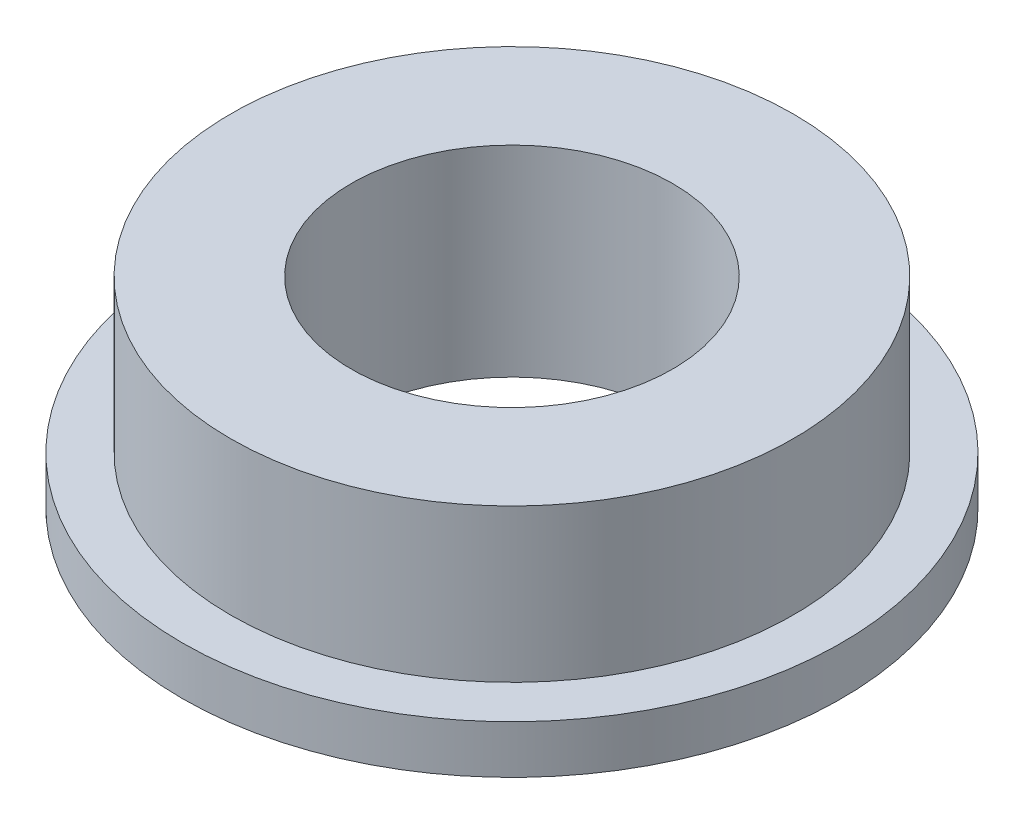
ISO-10303-21;
HEADER;
FILE_DESCRIPTION(('STEP AP214'),'2;1');
FILE_NAME('part.step','',(''),(''),'','','');
FILE_SCHEMA(('AUTOMOTIVE_DESIGN { 1 0 10303 214 1 1 1 1 }'));
ENDSEC;
DATA;
#1=APPLICATION_CONTEXT('core data for automotive mechanical design processes');
#2=APPLICATION_PROTOCOL_DEFINITION('international standard','automotive_design',2000,#1);
#3=PRODUCT_CONTEXT('',#1,'mechanical');
#4=PRODUCT('Part','Part','',(#3));
#5=PRODUCT_RELATED_PRODUCT_CATEGORY('part','',(#4));
#6=PRODUCT_DEFINITION_FORMATION('','',#4);
#7=PRODUCT_DEFINITION_CONTEXT('part definition',#1,'design');
#8=PRODUCT_DEFINITION('design','',#6,#7);
#9=PRODUCT_DEFINITION_SHAPE('','',#8);
#10=(LENGTH_UNIT() NAMED_UNIT(*) SI_UNIT(.MILLI.,.METRE.));
#11=(NAMED_UNIT(*) PLANE_ANGLE_UNIT() SI_UNIT($,.RADIAN.));
#12=(NAMED_UNIT(*) SI_UNIT($,.STERADIAN.) SOLID_ANGLE_UNIT());
#13=UNCERTAINTY_MEASURE_WITH_UNIT(LENGTH_MEASURE(1.E-05),#10,'distance_accuracy_value','');
#14=(GEOMETRIC_REPRESENTATION_CONTEXT(3) GLOBAL_UNCERTAINTY_ASSIGNED_CONTEXT((#13)) GLOBAL_UNIT_ASSIGNED_CONTEXT((#10,
#11,#12)) REPRESENTATION_CONTEXT('',''));
#15=CARTESIAN_POINT('',(0.,0.,0.));
#16=DIRECTION('',(0.,0.,1.));
#17=DIRECTION('',(1.,0.,0.));
#18=AXIS2_PLACEMENT_3D('',#15,#16,#17);
#19=CARTESIAN_POINT('',(0.,0.6,0.));
#20=DIRECTION('',(0.,-1.,0.));
#21=DIRECTION('',(0.,0.,-1.));
#22=AXIS2_PLACEMENT_3D('',#19,#20,#21);
#23=CYLINDRICAL_SURFACE('',#22,4.1);
#24=CARTESIAN_POINT('',(0.,0.6,0.));
#25=DIRECTION('',(0.,1.,0.));
#26=DIRECTION('',(0.,0.,1.));
#27=AXIS2_PLACEMENT_3D('',#24,#25,#26);
#28=CIRCLE('',#27,4.1);
#29=CARTESIAN_POINT('',(0.,0.6,4.1));
#30=VERTEX_POINT('',#29);
#31=EDGE_CURVE('E44',#30,#30,#28,.T.);
#32=ORIENTED_EDGE('',*,*,#31,.F.);
#33=EDGE_LOOP('',(#32));
#34=FACE_BOUND('',#33,.T.);
#35=CARTESIAN_POINT('',(0.,0.,0.));
#36=DIRECTION('',(0.,1.,0.));
#37=DIRECTION('',(0.,0.,1.));
#38=AXIS2_PLACEMENT_3D('',#35,#36,#37);
#39=CIRCLE('',#38,4.1);
#40=CARTESIAN_POINT('',(0.,0.,4.1));
#41=VERTEX_POINT('',#40);
#42=EDGE_CURVE('E40',#41,#41,#39,.T.);
#43=ORIENTED_EDGE('',*,*,#42,.T.);
#44=EDGE_LOOP('',(#43));
#45=FACE_BOUND('',#44,.T.);
#46=ADVANCED_FACE('F37',(#34,#45),#23,.T.);
#47=CARTESIAN_POINT('',(0.,0.6,0.));
#48=DIRECTION('',(0.,1.,0.));
#49=DIRECTION('',(0.,0.,1.));
#50=AXIS2_PLACEMENT_3D('',#47,#48,#49);
#51=PLANE('',#50);
#52=CARTESIAN_POINT('',(0.,0.6,0.));
#53=DIRECTION('',(0.,1.,0.));
#54=DIRECTION('',(0.,0.,1.));
#55=AXIS2_PLACEMENT_3D('',#52,#53,#54);
#56=CIRCLE('',#55,3.5);
#57=CARTESIAN_POINT('',(0.,0.6,-3.5));
#58=VERTEX_POINT('',#57);
#59=EDGE_CURVE('E10',#58,#58,#56,.T.);
#60=ORIENTED_EDGE('',*,*,#59,.F.);
#61=EDGE_LOOP('',(#60));
#62=FACE_BOUND('',#61,.T.);
#63=ORIENTED_EDGE('',*,*,#31,.T.);
#64=EDGE_LOOP('',(#63));
#65=FACE_BOUND('',#64,.T.);
#66=ADVANCED_FACE('F66',(#62,#65),#51,.T.);
#67=CARTESIAN_POINT('',(0.,0.,0.));
#68=DIRECTION('',(0.,1.,0.));
#69=DIRECTION('',(0.,0.,1.));
#70=AXIS2_PLACEMENT_3D('',#67,#68,#69);
#71=PLANE('',#70);
#72=CARTESIAN_POINT('',(0.,0.,0.));
#73=DIRECTION('',(0.,-1.,0.));
#74=DIRECTION('',(0.,0.,-1.));
#75=AXIS2_PLACEMENT_3D('',#72,#73,#74);
#76=CIRCLE('',#75,2.00000000000001);
#77=CARTESIAN_POINT('',(0.,0.,-2.00000000000001));
#78=VERTEX_POINT('',#77);
#79=EDGE_CURVE('E56',#78,#78,#76,.T.);
#80=ORIENTED_EDGE('',*,*,#79,.F.);
#81=EDGE_LOOP('',(#80));
#82=FACE_BOUND('',#81,.T.);
#83=ORIENTED_EDGE('',*,*,#42,.F.);
#84=EDGE_LOOP('',(#83));
#85=FACE_BOUND('',#84,.T.);
#86=ADVANCED_FACE('F62',(#82,#85),#71,.F.);
#87=CARTESIAN_POINT('',(0.,2.5,0.));
#88=DIRECTION('',(0.,-1.,0.));
#89=DIRECTION('',(0.,0.,-1.));
#90=AXIS2_PLACEMENT_3D('',#87,#88,#89);
#91=CYLINDRICAL_SURFACE('',#90,3.5);
#92=CARTESIAN_POINT('',(0.,2.5,0.));
#93=DIRECTION('',(0.,1.,0.));
#94=DIRECTION('',(0.,0.,1.));
#95=AXIS2_PLACEMENT_3D('',#92,#93,#94);
#96=CIRCLE('',#95,3.5);
#97=CARTESIAN_POINT('',(0.,2.5,-3.5));
#98=VERTEX_POINT('',#97);
#99=EDGE_CURVE('E50',#98,#98,#96,.T.);
#100=CARTESIAN_POINT('',(0.,2.5,-3.5));
#101=CARTESIAN_POINT('',(0.,2.48020833333333,-3.5));
#102=CARTESIAN_POINT('',(0.,2.46041666666667,-3.5));
#103=CARTESIAN_POINT('',(0.,2.42083333333333,-3.5));
#104=CARTESIAN_POINT('',(0.,2.40104166666667,-3.5));
#105=CARTESIAN_POINT('',(0.,2.36145833333333,-3.5));
#106=CARTESIAN_POINT('',(0.,2.34166666666667,-3.5));
#107=CARTESIAN_POINT('',(0.,2.30208333333333,-3.5));
#108=CARTESIAN_POINT('',(0.,2.28229166666667,-3.5));
#109=CARTESIAN_POINT('',(0.,2.24270833333333,-3.5));
#110=CARTESIAN_POINT('',(0.,2.22291666666667,-3.5));
#111=CARTESIAN_POINT('',(0.,2.18333333333333,-3.5));
#112=CARTESIAN_POINT('',(0.,2.16354166666667,-3.5));
#113=CARTESIAN_POINT('',(0.,2.12395833333333,-3.5));
#114=CARTESIAN_POINT('',(0.,2.10416666666667,-3.5));
#115=CARTESIAN_POINT('',(0.,2.06458333333333,-3.5));
#116=CARTESIAN_POINT('',(0.,2.04479166666667,-3.5));
#117=CARTESIAN_POINT('',(0.,2.00520833333333,-3.5));
#118=CARTESIAN_POINT('',(0.,1.98541666666667,-3.5));
#119=CARTESIAN_POINT('',(0.,1.94583333333333,-3.5));
#120=CARTESIAN_POINT('',(0.,1.92604166666667,-3.5));
#121=CARTESIAN_POINT('',(0.,1.88645833333333,-3.5));
#122=CARTESIAN_POINT('',(0.,1.86666666666667,-3.5));
#123=CARTESIAN_POINT('',(0.,1.82708333333333,-3.5));
#124=CARTESIAN_POINT('',(0.,1.80729166666667,-3.5));
#125=CARTESIAN_POINT('',(0.,1.76770833333333,-3.5));
#126=CARTESIAN_POINT('',(0.,1.74791666666667,-3.5));
#127=CARTESIAN_POINT('',(0.,1.70833333333333,-3.5));
#128=CARTESIAN_POINT('',(0.,1.68854166666667,-3.5));
#129=CARTESIAN_POINT('',(0.,1.64895833333333,-3.5));
#130=CARTESIAN_POINT('',(0.,1.62916666666667,-3.5));
#131=CARTESIAN_POINT('',(0.,1.58958333333333,-3.5));
#132=CARTESIAN_POINT('',(0.,1.56979166666667,-3.5));
#133=CARTESIAN_POINT('',(0.,1.53020833333333,-3.5));
#134=CARTESIAN_POINT('',(0.,1.51041666666667,-3.5));
#135=CARTESIAN_POINT('',(0.,1.47083333333333,-3.5));
#136=CARTESIAN_POINT('',(0.,1.45104166666667,-3.5));
#137=CARTESIAN_POINT('',(0.,1.41145833333333,-3.5));
#138=CARTESIAN_POINT('',(0.,1.39166666666667,-3.5));
#139=CARTESIAN_POINT('',(0.,1.35208333333333,-3.5));
#140=CARTESIAN_POINT('',(0.,1.33229166666667,-3.5));
#141=CARTESIAN_POINT('',(0.,1.29270833333333,-3.5));
#142=CARTESIAN_POINT('',(0.,1.27291666666667,-3.5));
#143=CARTESIAN_POINT('',(0.,1.23333333333333,-3.5));
#144=CARTESIAN_POINT('',(0.,1.21354166666667,-3.5));
#145=CARTESIAN_POINT('',(0.,1.17395833333333,-3.5));
#146=CARTESIAN_POINT('',(0.,1.15416666666667,-3.5));
#147=CARTESIAN_POINT('',(0.,1.11458333333333,-3.5));
#148=CARTESIAN_POINT('',(0.,1.09479166666667,-3.5));
#149=CARTESIAN_POINT('',(0.,1.05520833333333,-3.5));
#150=CARTESIAN_POINT('',(0.,1.03541666666667,-3.5));
#151=CARTESIAN_POINT('',(0.,0.995833333333333,-3.5));
#152=CARTESIAN_POINT('',(0.,0.976041666666667,-3.5));
#153=CARTESIAN_POINT('',(0.,0.936458333333333,-3.5));
#154=CARTESIAN_POINT('',(0.,0.916666666666667,-3.5));
#155=CARTESIAN_POINT('',(0.,0.877083333333333,-3.5));
#156=CARTESIAN_POINT('',(0.,0.857291666666667,-3.5));
#157=CARTESIAN_POINT('',(0.,0.817708333333333,-3.5));
#158=CARTESIAN_POINT('',(0.,0.797916666666667,-3.5));
#159=CARTESIAN_POINT('',(0.,0.758333333333333,-3.5));
#160=CARTESIAN_POINT('',(0.,0.738541666666667,-3.5));
#161=CARTESIAN_POINT('',(0.,0.698958333333333,-3.5));
#162=CARTESIAN_POINT('',(0.,0.679166666666667,-3.5));
#163=CARTESIAN_POINT('',(0.,0.639583333333333,-3.5));
#164=CARTESIAN_POINT('',(0.,0.619791666666667,-3.5));
#165=CARTESIAN_POINT('',(0.,0.6,-3.5));
#166=B_SPLINE_CURVE_WITH_KNOTS('',3,(#100,#101,#102,#103,#104,#105,#106,#107,#108,#109,#110,
#111,#112,#113,#114,#115,#116,#117,#118,#119,#120,#121,#122,#123,#124,#125,#126,#127,#128,#129,
#130,#131,#132,#133,#134,#135,#136,#137,#138,#139,#140,#141,#142,#143,#144,#145,#146,#147,#148,
#149,#150,#151,#152,#153,#154,#155,#156,#157,#158,#159,#160,#161,#162,#163,#164,#165),
.UNSPECIFIED.,.F.,.F.,(4,2,2,2,2,2,2,2,2,2,2,2,2,2,2,2,2,2,2,2,2,2,2,2,2,2,2,2,2,2,2,2,4),(0.,
0.059375,0.11875,0.178125,0.2375,0.296875,0.35625,0.415625,0.475,0.534375,0.59375,0.653125,
0.7125,0.771875,0.831249999999999,0.890625,0.95,1.009375,1.06875,1.128125,1.1875,1.246875,
1.30625,1.365625,1.425,1.484375,1.54375,1.603125,1.6625,1.721875,1.78125,1.840625,1.9),.UNSPECIFIED.);
#167=EDGE_CURVE('BSEAM65',#98,#58,#166,.T.);
#168=ORIENTED_EDGE('',*,*,#99,.F.);
#169=ORIENTED_EDGE('',*,*,#59,.T.);
#170=ORIENTED_EDGE('',*,*,#167,.T.);
#171=ORIENTED_EDGE('',*,*,#167,.F.);
#172=EDGE_LOOP('',(#168,#170,#169,#171));
#173=FACE_BOUND('',#172,.T.);
#174=ADVANCED_FACE('F65',(#173),#91,.T.);
#175=CARTESIAN_POINT('',(0.,2.5,0.));
#176=DIRECTION('',(0.,1.,0.));
#177=DIRECTION('',(0.,0.,1.));
#178=AXIS2_PLACEMENT_3D('',#175,#176,#177);
#179=PLANE('',#178);
#180=CARTESIAN_POINT('',(0.,2.5,0.));
#181=DIRECTION('',(0.,-1.,0.));
#182=DIRECTION('',(0.,0.,-1.));
#183=AXIS2_PLACEMENT_3D('',#180,#181,#182);
#184=CIRCLE('',#183,2.00000000000001);
#185=CARTESIAN_POINT('',(0.,2.5,-2.00000000000001));
#186=VERTEX_POINT('',#185);
#187=EDGE_CURVE('E53',#186,#186,#184,.T.);
#188=ORIENTED_EDGE('',*,*,#187,.T.);
#189=EDGE_LOOP('',(#188));
#190=FACE_BOUND('',#189,.T.);
#191=ORIENTED_EDGE('',*,*,#99,.T.);
#192=EDGE_LOOP('',(#191));
#193=FACE_BOUND('',#192,.T.);
#194=ADVANCED_FACE('F84',(#190,#193),#179,.T.);
#195=CARTESIAN_POINT('',(0.,0.,0.));
#196=DIRECTION('',(0.,-1.,0.));
#197=DIRECTION('',(0.,0.,-1.));
#198=AXIS2_PLACEMENT_3D('',#195,#196,#197);
#199=CYLINDRICAL_SURFACE('',#198,2.00000000000001);
#200=ORIENTED_EDGE('',*,*,#187,.F.);
#201=EDGE_LOOP('',(#200));
#202=FACE_BOUND('',#201,.T.);
#203=ORIENTED_EDGE('',*,*,#79,.T.);
#204=EDGE_LOOP('',(#203));
#205=FACE_BOUND('',#204,.T.);
#206=ADVANCED_FACE('F60',(#202,#205),#199,.F.);
#207=CLOSED_SHELL('',(#46,#66,#86,#174,#194,#206));
#208=MANIFOLD_SOLID_BREP('B2',#207);
#209=ADVANCED_BREP_SHAPE_REPRESENTATION('',(#18,#208),#14);
#210=SHAPE_DEFINITION_REPRESENTATION(#9,#209);
ENDSEC;
END-ISO-10303-21;
